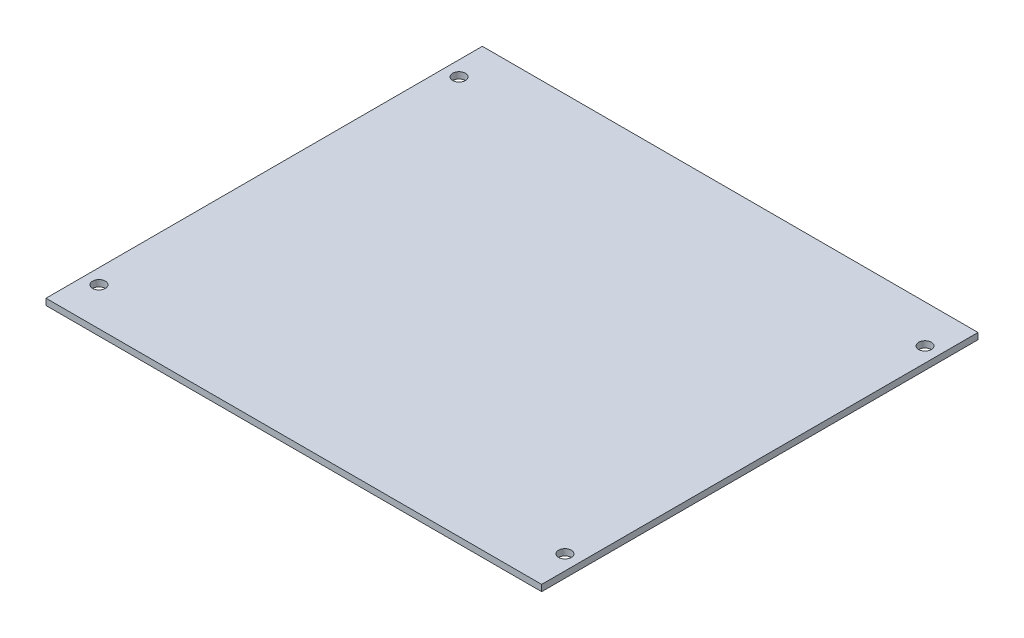
ISO-10303-21;
HEADER;
FILE_DESCRIPTION(('STEP AP214'),'2;1');
FILE_NAME('part.step','',(''),(''),'','','');
FILE_SCHEMA(('AUTOMOTIVE_DESIGN { 1 0 10303 214 1 1 1 1 }'));
ENDSEC;
DATA;
#1=APPLICATION_CONTEXT('core data for automotive mechanical design processes');
#2=APPLICATION_PROTOCOL_DEFINITION('international standard','automotive_design',2000,#1);
#3=PRODUCT_CONTEXT('',#1,'mechanical');
#4=PRODUCT('Part','Part','',(#3));
#5=PRODUCT_RELATED_PRODUCT_CATEGORY('part','',(#4));
#6=PRODUCT_DEFINITION_FORMATION('','',#4);
#7=PRODUCT_DEFINITION_CONTEXT('part definition',#1,'design');
#8=PRODUCT_DEFINITION('design','',#6,#7);
#9=PRODUCT_DEFINITION_SHAPE('','',#8);
#10=(LENGTH_UNIT() NAMED_UNIT(*) SI_UNIT(.MILLI.,.METRE.));
#11=(NAMED_UNIT(*) PLANE_ANGLE_UNIT() SI_UNIT($,.RADIAN.));
#12=(NAMED_UNIT(*) SI_UNIT($,.STERADIAN.) SOLID_ANGLE_UNIT());
#13=UNCERTAINTY_MEASURE_WITH_UNIT(LENGTH_MEASURE(1.E-05),#10,'distance_accuracy_value','');
#14=(GEOMETRIC_REPRESENTATION_CONTEXT(3) GLOBAL_UNCERTAINTY_ASSIGNED_CONTEXT((#13)) GLOBAL_UNIT_ASSIGNED_CONTEXT((#10,
#11,#12)) REPRESENTATION_CONTEXT('',''));
#15=CARTESIAN_POINT('',(0.,0.,0.));
#16=DIRECTION('',(0.,0.,1.));
#17=DIRECTION('',(1.,0.,0.));
#18=AXIS2_PLACEMENT_3D('',#15,#16,#17);
#19=CARTESIAN_POINT('',(0.,1.5,0.));
#20=DIRECTION('',(0.,1.,0.));
#21=DIRECTION('',(0.,0.,1.));
#22=AXIS2_PLACEMENT_3D('',#19,#20,#21);
#23=PLANE('',#22);
#24=CARTESIAN_POINT('',(55.,1.5,42.5));
#25=DIRECTION('',(0.,1.,0.));
#26=DIRECTION('',(0.,0.,1.));
#27=AXIS2_PLACEMENT_3D('',#24,#25,#26);
#28=CIRCLE('',#27,1.5);
#29=CARTESIAN_POINT('',(55.,1.5,44.));
#30=VERTEX_POINT('',#29);
#31=EDGE_CURVE('E123',#30,#30,#28,.T.);
#32=ORIENTED_EDGE('',*,*,#31,.F.);
#33=EDGE_LOOP('',(#32));
#34=FACE_BOUND('',#33,.T.);
#35=CARTESIAN_POINT('',(-55.,1.5,-42.5));
#36=DIRECTION('',(0.,1.,0.));
#37=DIRECTION('',(0.,0.,1.));
#38=AXIS2_PLACEMENT_3D('',#35,#36,#37);
#39=CIRCLE('',#38,1.5);
#40=CARTESIAN_POINT('',(-55.,1.5,-41.));
#41=VERTEX_POINT('',#40);
#42=EDGE_CURVE('E102',#41,#41,#39,.T.);
#43=ORIENTED_EDGE('',*,*,#42,.F.);
#44=EDGE_LOOP('',(#43));
#45=FACE_BOUND('',#44,.T.);
#46=DIRECTION('',(0.,0.,-1.));
#47=VECTOR('',#46,1.);
#48=CARTESIAN_POINT('',(58.5,1.5,-51.5));
#49=LINE('',#48,#47);
#50=CARTESIAN_POINT('',(58.5,1.5,51.5));
#51=VERTEX_POINT('',#50);
#52=CARTESIAN_POINT('',(58.5,1.5,-51.5));
#53=VERTEX_POINT('',#52);
#54=EDGE_CURVE('E87',#51,#53,#49,.T.);
#55=ORIENTED_EDGE('',*,*,#54,.T.);
#56=DIRECTION('',(-1.,0.,0.));
#57=VECTOR('',#56,1.);
#58=CARTESIAN_POINT('',(-58.5,1.5,-51.5));
#59=LINE('',#58,#57);
#60=CARTESIAN_POINT('',(-58.5,1.5,-51.5));
#61=VERTEX_POINT('',#60);
#62=EDGE_CURVE('E82',#53,#61,#59,.T.);
#63=ORIENTED_EDGE('',*,*,#62,.T.);
#64=DIRECTION('',(0.,0.,1.));
#65=VECTOR('',#64,1.);
#66=CARTESIAN_POINT('',(-58.5,1.5,-51.5));
#67=LINE('',#66,#65);
#68=CARTESIAN_POINT('',(-58.5,1.5,51.5));
#69=VERTEX_POINT('',#68);
#70=EDGE_CURVE('E85',#61,#69,#67,.T.);
#71=ORIENTED_EDGE('',*,*,#70,.T.);
#72=DIRECTION('',(1.,0.,0.));
#73=VECTOR('',#72,1.);
#74=CARTESIAN_POINT('',(-58.5,1.5,51.5));
#75=LINE('',#74,#73);
#76=EDGE_CURVE('E52',#69,#51,#75,.T.);
#77=ORIENTED_EDGE('',*,*,#76,.T.);
#78=EDGE_LOOP('',(#55,#63,#71,#77));
#79=FACE_BOUND('',#78,.T.);
#80=CARTESIAN_POINT('',(55.,1.5,-42.5));
#81=DIRECTION('',(0.,1.,0.));
#82=DIRECTION('',(0.,0.,1.));
#83=AXIS2_PLACEMENT_3D('',#80,#81,#82);
#84=CIRCLE('',#83,1.5);
#85=CARTESIAN_POINT('',(55.,1.5,-41.));
#86=VERTEX_POINT('',#85);
#87=EDGE_CURVE('E117',#86,#86,#84,.T.);
#88=ORIENTED_EDGE('',*,*,#87,.F.);
#89=EDGE_LOOP('',(#88));
#90=FACE_BOUND('',#89,.T.);
#91=CARTESIAN_POINT('',(-55.,1.5,42.5));
#92=DIRECTION('',(0.,1.,0.));
#93=DIRECTION('',(0.,0.,1.));
#94=AXIS2_PLACEMENT_3D('',#91,#92,#93);
#95=CIRCLE('',#94,1.5);
#96=CARTESIAN_POINT('',(-55.,1.5,44.));
#97=VERTEX_POINT('',#96);
#98=EDGE_CURVE('E129',#97,#97,#95,.T.);
#99=ORIENTED_EDGE('',*,*,#98,.F.);
#100=EDGE_LOOP('',(#99));
#101=FACE_BOUND('',#100,.T.);
#102=ADVANCED_FACE('F35',(#34,#45,#79,#90,#101),#23,.T.);
#103=CARTESIAN_POINT('',(0.,0.,0.));
#104=DIRECTION('',(0.,1.,0.));
#105=DIRECTION('',(0.,0.,1.));
#106=AXIS2_PLACEMENT_3D('',#103,#104,#105);
#107=PLANE('',#106);
#108=CARTESIAN_POINT('',(55.,0.,42.5));
#109=DIRECTION('',(0.,1.,0.));
#110=DIRECTION('',(0.,0.,1.));
#111=AXIS2_PLACEMENT_3D('',#108,#109,#110);
#112=CIRCLE('',#111,1.5);
#113=CARTESIAN_POINT('',(55.,0.,44.));
#114=VERTEX_POINT('',#113);
#115=EDGE_CURVE('E126',#114,#114,#112,.T.);
#116=ORIENTED_EDGE('',*,*,#115,.T.);
#117=EDGE_LOOP('',(#116));
#118=FACE_BOUND('',#117,.T.);
#119=CARTESIAN_POINT('',(-55.,0.,-42.5));
#120=DIRECTION('',(0.,1.,0.));
#121=DIRECTION('',(0.,0.,1.));
#122=AXIS2_PLACEMENT_3D('',#119,#120,#121);
#123=CIRCLE('',#122,1.5);
#124=CARTESIAN_POINT('',(-55.,0.,-41.));
#125=VERTEX_POINT('',#124);
#126=EDGE_CURVE('E114',#125,#125,#123,.T.);
#127=ORIENTED_EDGE('',*,*,#126,.T.);
#128=EDGE_LOOP('',(#127));
#129=FACE_BOUND('',#128,.T.);
#130=DIRECTION('',(0.,0.,-1.));
#131=VECTOR('',#130,1.);
#132=CARTESIAN_POINT('',(58.5,0.,-51.5));
#133=LINE('',#132,#131);
#134=CARTESIAN_POINT('',(58.5,0.,51.5));
#135=VERTEX_POINT('',#134);
#136=CARTESIAN_POINT('',(58.5,0.,-51.5));
#137=VERTEX_POINT('',#136);
#138=EDGE_CURVE('E99',#135,#137,#133,.T.);
#139=ORIENTED_EDGE('',*,*,#138,.F.);
#140=DIRECTION('',(1.,0.,0.));
#141=VECTOR('',#140,1.);
#142=CARTESIAN_POINT('',(-58.5,0.,51.5));
#143=LINE('',#142,#141);
#144=CARTESIAN_POINT('',(-58.5,0.,51.5));
#145=VERTEX_POINT('',#144);
#146=EDGE_CURVE('E75',#145,#135,#143,.T.);
#147=ORIENTED_EDGE('',*,*,#146,.F.);
#148=DIRECTION('',(0.,0.,1.));
#149=VECTOR('',#148,1.);
#150=CARTESIAN_POINT('',(-58.5,0.,-51.5));
#151=LINE('',#150,#149);
#152=CARTESIAN_POINT('',(-58.5,0.,-51.5));
#153=VERTEX_POINT('',#152);
#154=EDGE_CURVE('E69',#153,#145,#151,.T.);
#155=ORIENTED_EDGE('',*,*,#154,.F.);
#156=DIRECTION('',(-1.,0.,0.));
#157=VECTOR('',#156,1.);
#158=CARTESIAN_POINT('',(-58.5,0.,-51.5));
#159=LINE('',#158,#157);
#160=EDGE_CURVE('E91',#137,#153,#159,.T.);
#161=ORIENTED_EDGE('',*,*,#160,.F.);
#162=EDGE_LOOP('',(#139,#147,#155,#161));
#163=FACE_BOUND('',#162,.T.);
#164=CARTESIAN_POINT('',(55.,0.,-42.5));
#165=DIRECTION('',(0.,1.,0.));
#166=DIRECTION('',(0.,0.,1.));
#167=AXIS2_PLACEMENT_3D('',#164,#165,#166);
#168=CIRCLE('',#167,1.5);
#169=CARTESIAN_POINT('',(55.,0.,-41.));
#170=VERTEX_POINT('',#169);
#171=EDGE_CURVE('E120',#170,#170,#168,.T.);
#172=ORIENTED_EDGE('',*,*,#171,.T.);
#173=EDGE_LOOP('',(#172));
#174=FACE_BOUND('',#173,.T.);
#175=CARTESIAN_POINT('',(-55.,0.,42.5));
#176=DIRECTION('',(0.,1.,0.));
#177=DIRECTION('',(0.,0.,1.));
#178=AXIS2_PLACEMENT_3D('',#175,#176,#177);
#179=CIRCLE('',#178,1.5);
#180=CARTESIAN_POINT('',(-55.,0.,44.));
#181=VERTEX_POINT('',#180);
#182=EDGE_CURVE('E132',#181,#181,#179,.T.);
#183=ORIENTED_EDGE('',*,*,#182,.T.);
#184=EDGE_LOOP('',(#183));
#185=FACE_BOUND('',#184,.T.);
#186=ADVANCED_FACE('F110',(#118,#129,#163,#174,#185),#107,.F.);
#187=CARTESIAN_POINT('',(58.5,1.5,-51.5));
#188=DIRECTION('',(-1.,0.,0.));
#189=DIRECTION('',(0.,0.,1.));
#190=AXIS2_PLACEMENT_3D('',#187,#188,#189);
#191=PLANE('',#190);
#192=ORIENTED_EDGE('',*,*,#138,.T.);
#193=DIRECTION('',(0.,-1.,0.));
#194=VECTOR('',#193,1.);
#195=CARTESIAN_POINT('',(58.5,1.5,-51.5));
#196=LINE('',#195,#194);
#197=EDGE_CURVE('E11',#53,#137,#196,.T.);
#198=ORIENTED_EDGE('',*,*,#197,.F.);
#199=ORIENTED_EDGE('',*,*,#54,.F.);
#200=DIRECTION('',(0.,-1.,0.));
#201=VECTOR('',#200,1.);
#202=CARTESIAN_POINT('',(58.5,1.5,51.5));
#203=LINE('',#202,#201);
#204=EDGE_CURVE('E95',#51,#135,#203,.T.);
#205=ORIENTED_EDGE('',*,*,#204,.T.);
#206=EDGE_LOOP('',(#192,#198,#199,#205));
#207=FACE_BOUND('',#206,.T.);
#208=ADVANCED_FACE('F37',(#207),#191,.F.);
#209=CARTESIAN_POINT('',(-58.5,1.5,-51.5));
#210=DIRECTION('',(0.,0.,1.));
#211=DIRECTION('',(1.,0.,0.));
#212=AXIS2_PLACEMENT_3D('',#209,#210,#211);
#213=PLANE('',#212);
#214=ORIENTED_EDGE('',*,*,#160,.T.);
#215=DIRECTION('',(0.,-1.,0.));
#216=VECTOR('',#215,1.);
#217=CARTESIAN_POINT('',(-58.5,1.5,-51.5));
#218=LINE('',#217,#216);
#219=EDGE_CURVE('E44',#61,#153,#218,.T.);
#220=ORIENTED_EDGE('',*,*,#219,.F.);
#221=ORIENTED_EDGE('',*,*,#62,.F.);
#222=ORIENTED_EDGE('',*,*,#197,.T.);
#223=EDGE_LOOP('',(#214,#220,#221,#222));
#224=FACE_BOUND('',#223,.T.);
#225=ADVANCED_FACE('F90',(#224),#213,.F.);
#226=CARTESIAN_POINT('',(-58.5,1.5,-51.5));
#227=DIRECTION('',(1.,0.,0.));
#228=DIRECTION('',(0.,0.,-1.));
#229=AXIS2_PLACEMENT_3D('',#226,#227,#228);
#230=PLANE('',#229);
#231=ORIENTED_EDGE('',*,*,#154,.T.);
#232=DIRECTION('',(0.,-1.,0.));
#233=VECTOR('',#232,1.);
#234=CARTESIAN_POINT('',(-58.5,1.5,51.5));
#235=LINE('',#234,#233);
#236=EDGE_CURVE('E92',#69,#145,#235,.T.);
#237=ORIENTED_EDGE('',*,*,#236,.F.);
#238=ORIENTED_EDGE('',*,*,#70,.F.);
#239=ORIENTED_EDGE('',*,*,#219,.T.);
#240=EDGE_LOOP('',(#231,#237,#238,#239));
#241=FACE_BOUND('',#240,.T.);
#242=ADVANCED_FACE('F93',(#241),#230,.F.);
#243=CARTESIAN_POINT('',(-58.5,1.5,51.5));
#244=DIRECTION('',(0.,0.,-1.));
#245=DIRECTION('',(-1.,0.,0.));
#246=AXIS2_PLACEMENT_3D('',#243,#244,#245);
#247=PLANE('',#246);
#248=ORIENTED_EDGE('',*,*,#146,.T.);
#249=ORIENTED_EDGE('',*,*,#204,.F.);
#250=ORIENTED_EDGE('',*,*,#76,.F.);
#251=ORIENTED_EDGE('',*,*,#236,.T.);
#252=EDGE_LOOP('',(#248,#249,#250,#251));
#253=FACE_BOUND('',#252,.T.);
#254=ADVANCED_FACE('F107',(#253),#247,.F.);
#255=CARTESIAN_POINT('',(-55.,1.5,-42.5));
#256=DIRECTION('',(0.,-1.,0.));
#257=DIRECTION('',(0.,0.,-1.));
#258=AXIS2_PLACEMENT_3D('',#255,#256,#257);
#259=CYLINDRICAL_SURFACE('',#258,1.5);
#260=ORIENTED_EDGE('',*,*,#42,.T.);
#261=EDGE_LOOP('',(#260));
#262=FACE_BOUND('',#261,.T.);
#263=ORIENTED_EDGE('',*,*,#126,.F.);
#264=EDGE_LOOP('',(#263));
#265=FACE_BOUND('',#264,.T.);
#266=ADVANCED_FACE('F152',(#262,#265),#259,.F.);
#267=CARTESIAN_POINT('',(55.,1.5,-42.5));
#268=DIRECTION('',(0.,-1.,0.));
#269=DIRECTION('',(0.,0.,-1.));
#270=AXIS2_PLACEMENT_3D('',#267,#268,#269);
#271=CYLINDRICAL_SURFACE('',#270,1.5);
#272=ORIENTED_EDGE('',*,*,#87,.T.);
#273=EDGE_LOOP('',(#272));
#274=FACE_BOUND('',#273,.T.);
#275=ORIENTED_EDGE('',*,*,#171,.F.);
#276=EDGE_LOOP('',(#275));
#277=FACE_BOUND('',#276,.T.);
#278=ADVANCED_FACE('F198',(#274,#277),#271,.F.);
#279=CARTESIAN_POINT('',(55.,1.5,42.5));
#280=DIRECTION('',(0.,-1.,0.));
#281=DIRECTION('',(0.,0.,-1.));
#282=AXIS2_PLACEMENT_3D('',#279,#280,#281);
#283=CYLINDRICAL_SURFACE('',#282,1.5);
#284=ORIENTED_EDGE('',*,*,#31,.T.);
#285=EDGE_LOOP('',(#284));
#286=FACE_BOUND('',#285,.T.);
#287=ORIENTED_EDGE('',*,*,#115,.F.);
#288=EDGE_LOOP('',(#287));
#289=FACE_BOUND('',#288,.T.);
#290=ADVANCED_FACE('F206',(#286,#289),#283,.F.);
#291=CARTESIAN_POINT('',(-55.,1.5,42.5));
#292=DIRECTION('',(0.,-1.,0.));
#293=DIRECTION('',(0.,0.,-1.));
#294=AXIS2_PLACEMENT_3D('',#291,#292,#293);
#295=CYLINDRICAL_SURFACE('',#294,1.5);
#296=ORIENTED_EDGE('',*,*,#98,.T.);
#297=EDGE_LOOP('',(#296));
#298=FACE_BOUND('',#297,.T.);
#299=ORIENTED_EDGE('',*,*,#182,.F.);
#300=EDGE_LOOP('',(#299));
#301=FACE_BOUND('',#300,.T.);
#302=ADVANCED_FACE('F138',(#298,#301),#295,.F.);
#303=CLOSED_SHELL('',(#102,#186,#208,#225,#242,#254,#266,#278,#290,#302));
#304=MANIFOLD_SOLID_BREP('B2',#303);
#305=ADVANCED_BREP_SHAPE_REPRESENTATION('',(#18,#304),#14);
#306=SHAPE_DEFINITION_REPRESENTATION(#9,#305);
ENDSEC;
END-ISO-10303-21;
